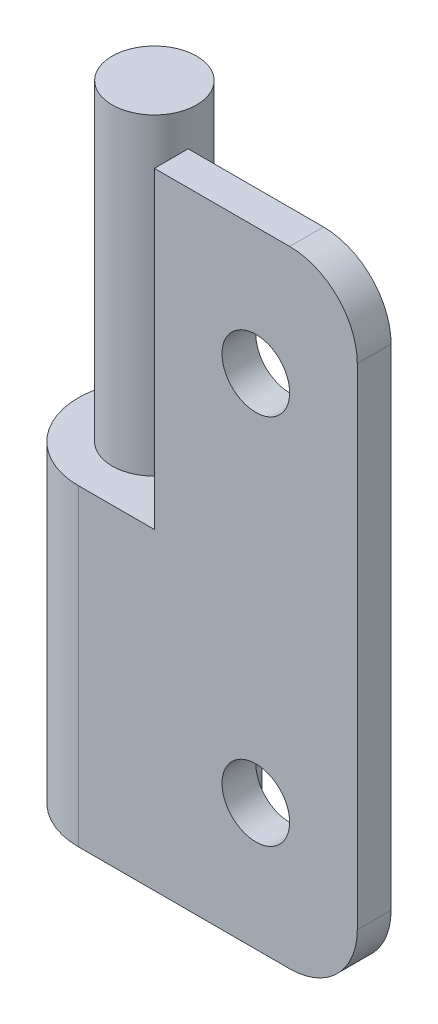
ISO-10303-21;
HEADER;
FILE_DESCRIPTION(('STEP AP214'),'2;1');
FILE_NAME('part.step','',(''),(''),'','','');
FILE_SCHEMA(('AUTOMOTIVE_DESIGN { 1 0 10303 214 1 1 1 1 }'));
ENDSEC;
DATA;
#1=APPLICATION_CONTEXT('core data for automotive mechanical design processes');
#2=APPLICATION_PROTOCOL_DEFINITION('international standard','automotive_design',2000,#1);
#3=PRODUCT_CONTEXT('',#1,'mechanical');
#4=PRODUCT('Part','Part','',(#3));
#5=PRODUCT_RELATED_PRODUCT_CATEGORY('part','',(#4));
#6=PRODUCT_DEFINITION_FORMATION('','',#4);
#7=PRODUCT_DEFINITION_CONTEXT('part definition',#1,'design');
#8=PRODUCT_DEFINITION('design','',#6,#7);
#9=PRODUCT_DEFINITION_SHAPE('','',#8);
#10=(LENGTH_UNIT() NAMED_UNIT(*) SI_UNIT(.MILLI.,.METRE.));
#11=(NAMED_UNIT(*) PLANE_ANGLE_UNIT() SI_UNIT($,.RADIAN.));
#12=(NAMED_UNIT(*) SI_UNIT($,.STERADIAN.) SOLID_ANGLE_UNIT());
#13=UNCERTAINTY_MEASURE_WITH_UNIT(LENGTH_MEASURE(1.E-05),#10,'distance_accuracy_value','');
#14=(GEOMETRIC_REPRESENTATION_CONTEXT(3) GLOBAL_UNCERTAINTY_ASSIGNED_CONTEXT((#13)) GLOBAL_UNIT_ASSIGNED_CONTEXT((#10,
#11,#12)) REPRESENTATION_CONTEXT('',''));
#15=CARTESIAN_POINT('',(0.,0.,0.));
#16=DIRECTION('',(0.,0.,1.));
#17=DIRECTION('',(1.,0.,0.));
#18=AXIS2_PLACEMENT_3D('',#15,#16,#17);
#19=CARTESIAN_POINT('',(0.,18.5,0.));
#20=DIRECTION('',(0.,1.,0.));
#21=DIRECTION('',(0.,0.,1.));
#22=AXIS2_PLACEMENT_3D('',#19,#20,#21);
#23=PLANE('',#22);
#24=DIRECTION('',(0.,0.,1.));
#25=VECTOR('',#24,1.);
#26=CARTESIAN_POINT('',(4.5,18.5,2.5));
#27=LINE('',#26,#25);
#28=CARTESIAN_POINT('',(4.5,18.5,2.5));
#29=VERTEX_POINT('',#28);
#30=CARTESIAN_POINT('',(4.5,18.5,4.5));
#31=VERTEX_POINT('',#30);
#32=EDGE_CURVE('E110',#29,#31,#27,.T.);
#33=ORIENTED_EDGE('',*,*,#32,.F.);
#34=DIRECTION('',(-1.,0.,0.));
#35=VECTOR('',#34,1.);
#36=CARTESIAN_POINT('',(16.5,18.5,2.5));
#37=LINE('',#36,#35);
#38=CARTESIAN_POINT('',(3.74165738677394,18.5,2.5));
#39=VERTEX_POINT('',#38);
#40=EDGE_CURVE('E117',#29,#39,#37,.T.);
#41=ORIENTED_EDGE('',*,*,#40,.T.);
#42=CARTESIAN_POINT('',(0.,18.5,0.));
#43=DIRECTION('',(0.,1.,0.));
#44=DIRECTION('',(0.,0.,1.));
#45=AXIS2_PLACEMENT_3D('',#42,#43,#44);
#46=CIRCLE('',#45,4.5);
#47=CARTESIAN_POINT('',(0.,18.5,4.5));
#48=VERTEX_POINT('',#47);
#49=EDGE_CURVE('E137',#39,#48,#46,.T.);
#50=ORIENTED_EDGE('',*,*,#49,.T.);
#51=DIRECTION('',(1.,0.,0.));
#52=VECTOR('',#51,1.);
#53=CARTESIAN_POINT('',(0.,18.5,4.5));
#54=LINE('',#53,#52);
#55=EDGE_CURVE('E140',#48,#31,#54,.T.);
#56=ORIENTED_EDGE('',*,*,#55,.T.);
#57=EDGE_LOOP('',(#33,#41,#50,#56));
#58=FACE_BOUND('',#57,.T.);
#59=CARTESIAN_POINT('',(0.,18.5,0.));
#60=DIRECTION('',(0.,1.,0.));
#61=DIRECTION('',(0.,0.,1.));
#62=AXIS2_PLACEMENT_3D('',#59,#60,#61);
#63=CIRCLE('',#62,2.5);
#64=CARTESIAN_POINT('',(0.,18.5,2.5));
#65=VERTEX_POINT('',#64);
#66=EDGE_CURVE('E120',#65,#65,#63,.T.);
#67=ORIENTED_EDGE('',*,*,#66,.F.);
#68=EDGE_LOOP('',(#67));
#69=FACE_BOUND('',#68,.T.);
#70=ADVANCED_FACE('F35',(#58,#69),#23,.T.);
#71=CARTESIAN_POINT('',(0.,0.,0.));
#72=DIRECTION('',(0.,1.,0.));
#73=DIRECTION('',(0.,0.,1.));
#74=AXIS2_PLACEMENT_3D('',#71,#72,#73);
#75=PLANE('',#74);
#76=DIRECTION('',(-1.,0.,0.));
#77=VECTOR('',#76,1.);
#78=CARTESIAN_POINT('',(16.5,0.,2.5));
#79=LINE('',#78,#77);
#80=CARTESIAN_POINT('',(12.5,0.,2.5));
#81=VERTEX_POINT('',#80);
#82=CARTESIAN_POINT('',(3.74165738677394,0.,2.5));
#83=VERTEX_POINT('',#82);
#84=EDGE_CURVE('E141',#81,#83,#79,.T.);
#85=ORIENTED_EDGE('',*,*,#84,.F.);
#86=DIRECTION('',(0.,0.,-1.));
#87=VECTOR('',#86,1.);
#88=CARTESIAN_POINT('',(12.5,0.,0.));
#89=LINE('',#88,#87);
#90=CARTESIAN_POINT('',(12.5,0.,4.5));
#91=VERTEX_POINT('',#90);
#92=EDGE_CURVE('E11',#81,#91,#89,.F.);
#93=ORIENTED_EDGE('',*,*,#92,.T.);
#94=DIRECTION('',(1.,0.,0.));
#95=VECTOR('',#94,1.);
#96=CARTESIAN_POINT('',(0.,0.,4.5));
#97=LINE('',#96,#95);
#98=CARTESIAN_POINT('',(0.,0.,4.5));
#99=VERTEX_POINT('',#98);
#100=EDGE_CURVE('E147',#99,#91,#97,.T.);
#101=ORIENTED_EDGE('',*,*,#100,.F.);
#102=CARTESIAN_POINT('',(0.,0.,0.));
#103=DIRECTION('',(0.,1.,0.));
#104=DIRECTION('',(0.,0.,1.));
#105=AXIS2_PLACEMENT_3D('',#102,#103,#104);
#106=CIRCLE('',#105,4.5);
#107=EDGE_CURVE('E136',#83,#99,#106,.T.);
#108=ORIENTED_EDGE('',*,*,#107,.F.);
#109=EDGE_LOOP('',(#85,#93,#101,#108));
#110=FACE_BOUND('',#109,.T.);
#111=ADVANCED_FACE('F181',(#110),#75,.F.);
#112=CARTESIAN_POINT('',(0.,18.5,0.));
#113=DIRECTION('',(0.,-1.,0.));
#114=DIRECTION('',(0.,0.,-1.));
#115=AXIS2_PLACEMENT_3D('',#112,#113,#114);
#116=CYLINDRICAL_SURFACE('',#115,4.5);
#117=ORIENTED_EDGE('',*,*,#107,.T.);
#118=DIRECTION('',(0.,-1.,0.));
#119=VECTOR('',#118,1.);
#120=CARTESIAN_POINT('',(0.,18.5,4.5));
#121=LINE('',#120,#119);
#122=EDGE_CURVE('E157',#48,#99,#121,.T.);
#123=ORIENTED_EDGE('',*,*,#122,.F.);
#124=ORIENTED_EDGE('',*,*,#49,.F.);
#125=DIRECTION('',(0.,-1.,0.));
#126=VECTOR('',#125,1.);
#127=CARTESIAN_POINT('',(3.74165738677394,18.5,2.5));
#128=LINE('',#127,#126);
#129=EDGE_CURVE('E144',#39,#83,#128,.T.);
#130=ORIENTED_EDGE('',*,*,#129,.T.);
#131=EDGE_LOOP('',(#117,#123,#124,#130));
#132=FACE_BOUND('',#131,.T.);
#133=ADVANCED_FACE('F184',(#132),#116,.T.);
#134=CARTESIAN_POINT('',(0.,18.5,4.5));
#135=DIRECTION('',(0.,0.,-1.));
#136=DIRECTION('',(-1.,0.,0.));
#137=AXIS2_PLACEMENT_3D('',#134,#135,#136);
#138=PLANE('',#137);
#139=CARTESIAN_POINT('',(10.5,7.5,4.5));
#140=DIRECTION('',(0.,0.,-1.));
#141=DIRECTION('',(-1.,0.,0.));
#142=AXIS2_PLACEMENT_3D('',#139,#140,#141);
#143=CIRCLE('',#142,2.);
#144=CARTESIAN_POINT('',(8.5,7.5,4.5));
#145=VERTEX_POINT('',#144);
#146=EDGE_CURVE('E132',#145,#145,#143,.F.);
#147=ORIENTED_EDGE('',*,*,#146,.F.);
#148=EDGE_LOOP('',(#147));
#149=FACE_BOUND('',#148,.T.);
#150=CARTESIAN_POINT('',(10.5,29.5,4.5));
#151=DIRECTION('',(0.,0.,-1.));
#152=DIRECTION('',(-1.,0.,0.));
#153=AXIS2_PLACEMENT_3D('',#150,#151,#152);
#154=CIRCLE('',#153,2.);
#155=CARTESIAN_POINT('',(8.5,29.5,4.5));
#156=VERTEX_POINT('',#155);
#157=EDGE_CURVE('E204',#156,#156,#154,.F.);
#158=ORIENTED_EDGE('',*,*,#157,.F.);
#159=EDGE_LOOP('',(#158));
#160=FACE_BOUND('',#159,.T.);
#161=DIRECTION('',(0.,-1.,0.));
#162=VECTOR('',#161,1.);
#163=CARTESIAN_POINT('',(16.5,18.5,4.5));
#164=LINE('',#163,#162);
#165=CARTESIAN_POINT('',(16.5,33.,4.5));
#166=VERTEX_POINT('',#165);
#167=CARTESIAN_POINT('',(16.5,4.,4.5));
#168=VERTEX_POINT('',#167);
#169=EDGE_CURVE('E155',#166,#168,#164,.T.);
#170=ORIENTED_EDGE('',*,*,#169,.F.);
#171=CARTESIAN_POINT('',(12.5,33.,4.5));
#172=DIRECTION('',(0.,0.,-1.));
#173=DIRECTION('',(-1.,0.,0.));
#174=AXIS2_PLACEMENT_3D('',#171,#172,#173);
#175=CIRCLE('',#174,4.);
#176=CARTESIAN_POINT('',(12.5,37.,4.5));
#177=VERTEX_POINT('',#176);
#178=EDGE_CURVE('E43',#166,#177,#175,.F.);
#179=ORIENTED_EDGE('',*,*,#178,.T.);
#180=DIRECTION('',(1.,0.,0.));
#181=VECTOR('',#180,1.);
#182=CARTESIAN_POINT('',(16.5,37.,4.5));
#183=LINE('',#182,#181);
#184=CARTESIAN_POINT('',(4.5,37.,4.5));
#185=VERTEX_POINT('',#184);
#186=EDGE_CURVE('E126',#185,#177,#183,.T.);
#187=ORIENTED_EDGE('',*,*,#186,.F.);
#188=DIRECTION('',(0.,-1.,0.));
#189=VECTOR('',#188,1.);
#190=CARTESIAN_POINT('',(4.5,37.,4.5));
#191=LINE('',#190,#189);
#192=EDGE_CURVE('E121',#185,#31,#191,.T.);
#193=ORIENTED_EDGE('',*,*,#192,.T.);
#194=ORIENTED_EDGE('',*,*,#55,.F.);
#195=ORIENTED_EDGE('',*,*,#122,.T.);
#196=ORIENTED_EDGE('',*,*,#100,.T.);
#197=CARTESIAN_POINT('',(12.5,4.,4.5));
#198=DIRECTION('',(0.,0.,-1.));
#199=DIRECTION('',(-1.,0.,0.));
#200=AXIS2_PLACEMENT_3D('',#197,#198,#199);
#201=CIRCLE('',#200,4.);
#202=EDGE_CURVE('E55',#91,#168,#201,.F.);
#203=ORIENTED_EDGE('',*,*,#202,.T.);
#204=EDGE_LOOP('',(#170,#179,#187,#193,#194,#195,#196,#203));
#205=FACE_BOUND('',#204,.T.);
#206=ADVANCED_FACE('F171',(#149,#160,#205),#138,.F.);
#207=CARTESIAN_POINT('',(16.5,18.5,4.5));
#208=DIRECTION('',(-1.,0.,0.));
#209=DIRECTION('',(0.,0.,1.));
#210=AXIS2_PLACEMENT_3D('',#207,#208,#209);
#211=PLANE('',#210);
#212=DIRECTION('',(0.,-1.,0.));
#213=VECTOR('',#212,1.);
#214=CARTESIAN_POINT('',(16.5,18.5,2.5));
#215=LINE('',#214,#213);
#216=CARTESIAN_POINT('',(16.5,33.,2.5));
#217=VERTEX_POINT('',#216);
#218=CARTESIAN_POINT('',(16.5,4.,2.5));
#219=VERTEX_POINT('',#218);
#220=EDGE_CURVE('E152',#217,#219,#215,.T.);
#221=ORIENTED_EDGE('',*,*,#220,.F.);
#222=DIRECTION('',(0.,0.,-1.));
#223=VECTOR('',#222,1.);
#224=CARTESIAN_POINT('',(16.5,33.,4.5));
#225=LINE('',#224,#223);
#226=EDGE_CURVE('E168',#217,#166,#225,.F.);
#227=ORIENTED_EDGE('',*,*,#226,.T.);
#228=ORIENTED_EDGE('',*,*,#169,.T.);
#229=DIRECTION('',(0.,0.,-1.));
#230=VECTOR('',#229,1.);
#231=CARTESIAN_POINT('',(16.5,4.,4.5));
#232=LINE('',#231,#230);
#233=EDGE_CURVE('E165',#168,#219,#232,.T.);
#234=ORIENTED_EDGE('',*,*,#233,.T.);
#235=EDGE_LOOP('',(#221,#227,#228,#234));
#236=FACE_BOUND('',#235,.T.);
#237=ADVANCED_FACE('F177',(#236),#211,.F.);
#238=CARTESIAN_POINT('',(16.5,18.5,2.5));
#239=DIRECTION('',(0.,0.,1.));
#240=DIRECTION('',(1.,0.,0.));
#241=AXIS2_PLACEMENT_3D('',#238,#239,#240);
#242=PLANE('',#241);
#243=CARTESIAN_POINT('',(10.5,7.5,2.5));
#244=DIRECTION('',(0.,0.,-1.));
#245=DIRECTION('',(-1.,0.,0.));
#246=AXIS2_PLACEMENT_3D('',#243,#244,#245);
#247=CIRCLE('',#246,2.);
#248=CARTESIAN_POINT('',(8.5,7.5,2.5));
#249=VERTEX_POINT('',#248);
#250=EDGE_CURVE('E207',#249,#249,#247,.T.);
#251=ORIENTED_EDGE('',*,*,#250,.F.);
#252=EDGE_LOOP('',(#251));
#253=FACE_BOUND('',#252,.T.);
#254=CARTESIAN_POINT('',(10.5,29.5,2.5));
#255=DIRECTION('',(0.,0.,-1.));
#256=DIRECTION('',(1.,0.,0.));
#257=AXIS2_PLACEMENT_3D('',#254,#255,#256);
#258=CIRCLE('',#257,2.);
#259=CARTESIAN_POINT('',(12.5,29.5,2.5));
#260=VERTEX_POINT('',#259);
#261=EDGE_CURVE('E201',#260,#260,#258,.T.);
#262=ORIENTED_EDGE('',*,*,#261,.F.);
#263=EDGE_LOOP('',(#262));
#264=FACE_BOUND('',#263,.T.);
#265=DIRECTION('',(-1.,0.,0.));
#266=VECTOR('',#265,1.);
#267=CARTESIAN_POINT('',(16.5,37.,2.5));
#268=LINE('',#267,#266);
#269=CARTESIAN_POINT('',(12.5,37.,2.5));
#270=VERTEX_POINT('',#269);
#271=CARTESIAN_POINT('',(4.5,37.,2.5));
#272=VERTEX_POINT('',#271);
#273=EDGE_CURVE('E100',#270,#272,#268,.T.);
#274=ORIENTED_EDGE('',*,*,#273,.F.);
#275=CARTESIAN_POINT('',(12.5,33.,2.5));
#276=DIRECTION('',(0.,0.,1.));
#277=DIRECTION('',(1.,0.,0.));
#278=AXIS2_PLACEMENT_3D('',#275,#276,#277);
#279=CIRCLE('',#278,4.);
#280=EDGE_CURVE('E163',#270,#217,#279,.F.);
#281=ORIENTED_EDGE('',*,*,#280,.T.);
#282=ORIENTED_EDGE('',*,*,#220,.T.);
#283=CARTESIAN_POINT('',(12.5,4.,2.5));
#284=DIRECTION('',(0.,0.,1.));
#285=DIRECTION('',(1.,0.,0.));
#286=AXIS2_PLACEMENT_3D('',#283,#284,#285);
#287=CIRCLE('',#286,4.);
#288=EDGE_CURVE('E161',#219,#81,#287,.F.);
#289=ORIENTED_EDGE('',*,*,#288,.T.);
#290=ORIENTED_EDGE('',*,*,#84,.T.);
#291=ORIENTED_EDGE('',*,*,#129,.F.);
#292=ORIENTED_EDGE('',*,*,#40,.F.);
#293=DIRECTION('',(0.,-1.,0.));
#294=VECTOR('',#293,1.);
#295=CARTESIAN_POINT('',(4.5,37.,2.5));
#296=LINE('',#295,#294);
#297=EDGE_CURVE('E114',#272,#29,#296,.T.);
#298=ORIENTED_EDGE('',*,*,#297,.F.);
#299=EDGE_LOOP('',(#274,#281,#282,#289,#290,#291,#292,#298));
#300=FACE_BOUND('',#299,.T.);
#301=ADVANCED_FACE('F115',(#253,#264,#300),#242,.F.);
#302=CARTESIAN_POINT('',(4.5,37.,2.5));
#303=DIRECTION('',(1.,0.,0.));
#304=DIRECTION('',(0.,0.,-1.));
#305=AXIS2_PLACEMENT_3D('',#302,#303,#304);
#306=PLANE('',#305);
#307=ORIENTED_EDGE('',*,*,#32,.T.);
#308=ORIENTED_EDGE('',*,*,#192,.F.);
#309=DIRECTION('',(0.,0.,1.));
#310=VECTOR('',#309,1.);
#311=CARTESIAN_POINT('',(4.5,37.,2.5));
#312=LINE('',#311,#310);
#313=EDGE_CURVE('E105',#272,#185,#312,.T.);
#314=ORIENTED_EDGE('',*,*,#313,.F.);
#315=ORIENTED_EDGE('',*,*,#297,.T.);
#316=EDGE_LOOP('',(#307,#308,#314,#315));
#317=FACE_BOUND('',#316,.T.);
#318=ADVANCED_FACE('F123',(#317),#306,.F.);
#319=CARTESIAN_POINT('',(0.,37.,0.));
#320=DIRECTION('',(0.,-1.,0.));
#321=DIRECTION('',(0.,0.,-1.));
#322=AXIS2_PLACEMENT_3D('',#319,#320,#321);
#323=PLANE('',#322);
#324=ORIENTED_EDGE('',*,*,#186,.T.);
#325=DIRECTION('',(0.,0.,-1.));
#326=VECTOR('',#325,1.);
#327=CARTESIAN_POINT('',(12.5,37.,0.));
#328=LINE('',#327,#326);
#329=EDGE_CURVE('E108',#177,#270,#328,.T.);
#330=ORIENTED_EDGE('',*,*,#329,.T.);
#331=ORIENTED_EDGE('',*,*,#273,.T.);
#332=ORIENTED_EDGE('',*,*,#313,.T.);
#333=EDGE_LOOP('',(#324,#330,#331,#332));
#334=FACE_BOUND('',#333,.T.);
#335=ADVANCED_FACE('F103',(#334),#323,.F.);
#336=CARTESIAN_POINT('',(10.5,29.5,4.501));
#337=DIRECTION('',(0.,0.,-1.));
#338=DIRECTION('',(-1.,0.,0.));
#339=AXIS2_PLACEMENT_3D('',#336,#337,#338);
#340=CYLINDRICAL_SURFACE('',#339,2.);
#341=ORIENTED_EDGE('',*,*,#261,.T.);
#342=EDGE_LOOP('',(#341));
#343=FACE_BOUND('',#342,.T.);
#344=ORIENTED_EDGE('',*,*,#157,.T.);
#345=EDGE_LOOP('',(#344));
#346=FACE_BOUND('',#345,.T.);
#347=ADVANCED_FACE('F214',(#343,#346),#340,.F.);
#348=CARTESIAN_POINT('',(10.5,7.5,4.501));
#349=DIRECTION('',(0.,0.,-1.));
#350=DIRECTION('',(-1.,0.,0.));
#351=AXIS2_PLACEMENT_3D('',#348,#349,#350);
#352=CYLINDRICAL_SURFACE('',#351,2.);
#353=ORIENTED_EDGE('',*,*,#250,.T.);
#354=EDGE_LOOP('',(#353));
#355=FACE_BOUND('',#354,.T.);
#356=ORIENTED_EDGE('',*,*,#146,.T.);
#357=EDGE_LOOP('',(#356));
#358=FACE_BOUND('',#357,.T.);
#359=ADVANCED_FACE('F228',(#355,#358),#352,.F.);
#360=CARTESIAN_POINT('',(12.5,33.,0.));
#361=DIRECTION('',(0.,0.,-1.));
#362=DIRECTION('',(-1.,0.,0.));
#363=AXIS2_PLACEMENT_3D('',#360,#361,#362);
#364=CYLINDRICAL_SURFACE('',#363,4.);
#365=ORIENTED_EDGE('',*,*,#178,.F.);
#366=ORIENTED_EDGE('',*,*,#226,.F.);
#367=ORIENTED_EDGE('',*,*,#280,.F.);
#368=ORIENTED_EDGE('',*,*,#329,.F.);
#369=EDGE_LOOP('',(#365,#366,#367,#368));
#370=FACE_BOUND('',#369,.T.);
#371=ADVANCED_FACE('F174',(#370),#364,.T.);
#372=CARTESIAN_POINT('',(12.5,4.,4.5));
#373=DIRECTION('',(0.,0.,-1.));
#374=DIRECTION('',(-1.,0.,0.));
#375=AXIS2_PLACEMENT_3D('',#372,#373,#374);
#376=CYLINDRICAL_SURFACE('',#375,4.);
#377=ORIENTED_EDGE('',*,*,#202,.F.);
#378=ORIENTED_EDGE('',*,*,#92,.F.);
#379=ORIENTED_EDGE('',*,*,#288,.F.);
#380=ORIENTED_EDGE('',*,*,#233,.F.);
#381=EDGE_LOOP('',(#377,#378,#379,#380));
#382=FACE_BOUND('',#381,.T.);
#383=ADVANCED_FACE('F37',(#382),#376,.T.);
#384=CARTESIAN_POINT('',(0.,37.,0.));
#385=DIRECTION('',(0.,-1.,0.));
#386=DIRECTION('',(0.,0.,-1.));
#387=AXIS2_PLACEMENT_3D('',#384,#385,#386);
#388=CYLINDRICAL_SURFACE('',#387,2.5);
#389=ORIENTED_EDGE('',*,*,#66,.T.);
#390=EDGE_LOOP('',(#389));
#391=FACE_BOUND('',#390,.T.);
#392=CARTESIAN_POINT('',(0.,37.,0.));
#393=DIRECTION('',(0.,-1.,0.));
#394=DIRECTION('',(0.,0.,-1.));
#395=AXIS2_PLACEMENT_3D('',#392,#393,#394);
#396=CIRCLE('',#395,2.5);
#397=CARTESIAN_POINT('',(0.,37.,-2.5));
#398=VERTEX_POINT('',#397);
#399=EDGE_CURVE('E199',#398,#398,#396,.T.);
#400=ORIENTED_EDGE('',*,*,#399,.T.);
#401=EDGE_LOOP('',(#400));
#402=FACE_BOUND('',#401,.T.);
#403=ADVANCED_FACE('F192',(#391,#402),#388,.T.);
#404=CARTESIAN_POINT('',(0.,37.,0.));
#405=DIRECTION('',(0.,-1.,0.));
#406=DIRECTION('',(0.,0.,-1.));
#407=AXIS2_PLACEMENT_3D('',#404,#405,#406);
#408=PLANE('',#407);
#409=ORIENTED_EDGE('',*,*,#399,.F.);
#410=EDGE_LOOP('',(#409));
#411=FACE_BOUND('',#410,.T.);
#412=ADVANCED_FACE('F195',(#411),#408,.F.);
#413=CLOSED_SHELL('',(#70,#111,#133,#206,#237,#301,#318,#335,#347,#359,#371,#383,#403,#412));
#414=MANIFOLD_SOLID_BREP('B2',#413);
#415=ADVANCED_BREP_SHAPE_REPRESENTATION('',(#18,#414),#14);
#416=SHAPE_DEFINITION_REPRESENTATION(#9,#415);
ENDSEC;
END-ISO-10303-21;
